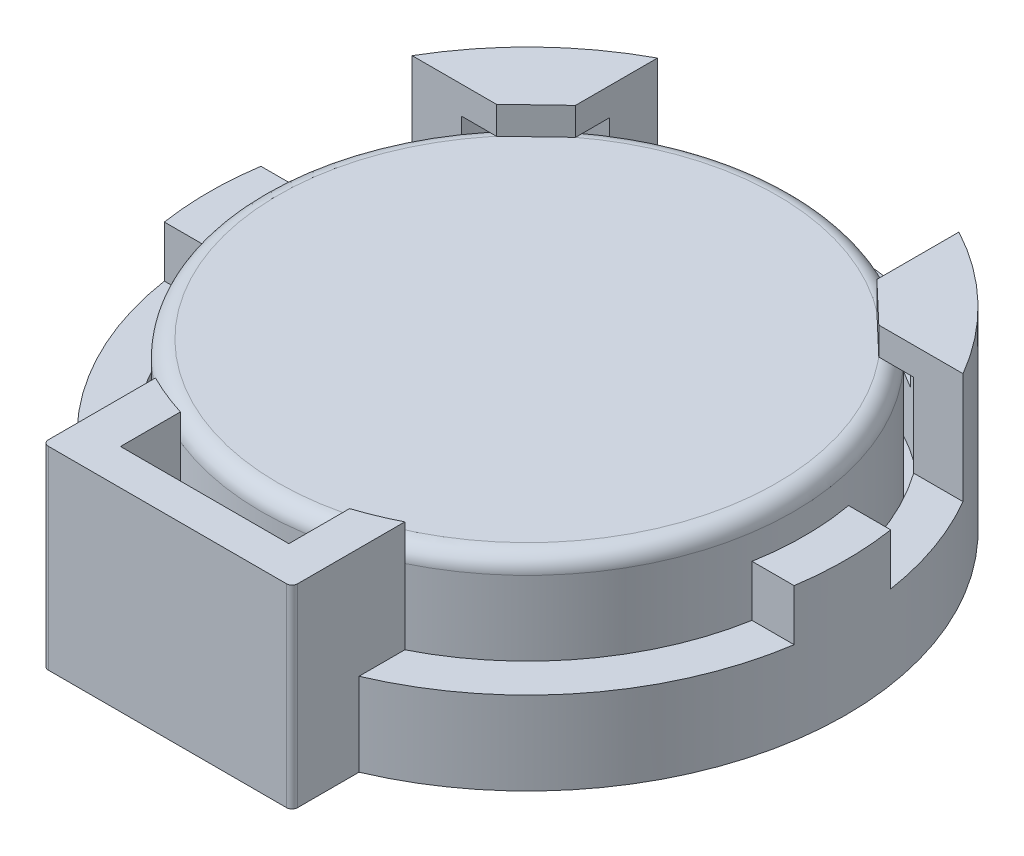
ISO-10303-21;
HEADER;
FILE_DESCRIPTION(('STEP AP214'),'2;1');
FILE_NAME('part.step','',(''),(''),'','','');
FILE_SCHEMA(('AUTOMOTIVE_DESIGN { 1 0 10303 214 1 1 1 1 }'));
ENDSEC;
DATA;
#1=APPLICATION_CONTEXT('core data for automotive mechanical design processes');
#2=APPLICATION_PROTOCOL_DEFINITION('international standard','automotive_design',2000,#1);
#3=PRODUCT_CONTEXT('',#1,'mechanical');
#4=PRODUCT('Part','Part','',(#3));
#5=PRODUCT_RELATED_PRODUCT_CATEGORY('part','',(#4));
#6=PRODUCT_DEFINITION_FORMATION('','',#4);
#7=PRODUCT_DEFINITION_CONTEXT('part definition',#1,'design');
#8=PRODUCT_DEFINITION('design','',#6,#7);
#9=PRODUCT_DEFINITION_SHAPE('','',#8);
#10=(LENGTH_UNIT() NAMED_UNIT(*) SI_UNIT(.MILLI.,.METRE.));
#11=(NAMED_UNIT(*) PLANE_ANGLE_UNIT() SI_UNIT($,.RADIAN.));
#12=(NAMED_UNIT(*) SI_UNIT($,.STERADIAN.) SOLID_ANGLE_UNIT());
#13=UNCERTAINTY_MEASURE_WITH_UNIT(LENGTH_MEASURE(1.E-05),#10,'distance_accuracy_value','');
#14=(GEOMETRIC_REPRESENTATION_CONTEXT(3) GLOBAL_UNCERTAINTY_ASSIGNED_CONTEXT((#13)) GLOBAL_UNIT_ASSIGNED_CONTEXT((#10,
#11,#12)) REPRESENTATION_CONTEXT('',''));
#15=CARTESIAN_POINT('',(0.,0.,0.));
#16=DIRECTION('',(0.,0.,1.));
#17=DIRECTION('',(1.,0.,0.));
#18=AXIS2_PLACEMENT_3D('',#15,#16,#17);
#19=CARTESIAN_POINT('',(0.,1.,0.));
#20=DIRECTION('',(0.,1.,0.));
#21=DIRECTION('',(0.,0.,1.));
#22=AXIS2_PLACEMENT_3D('',#19,#20,#21);
#23=CYLINDRICAL_SURFACE('',#22,10.);
#24=CARTESIAN_POINT('',(0.,1.,0.));
#25=DIRECTION('',(0.,1.,0.));
#26=DIRECTION('',(0.,0.,1.));
#27=AXIS2_PLACEMENT_3D('',#24,#25,#26);
#28=CIRCLE('',#27,10.);
#29=CARTESIAN_POINT('',(0.,1.,10.));
#30=VERTEX_POINT('',#29);
#31=EDGE_CURVE('E453',#30,#30,#28,.T.);
#32=ORIENTED_EDGE('',*,*,#31,.F.);
#33=EDGE_LOOP('',(#32));
#34=FACE_BOUND('',#33,.T.);
#35=CARTESIAN_POINT('',(0.,6.,0.));
#36=DIRECTION('',(0.,1.,0.));
#37=DIRECTION('',(0.,0.,1.));
#38=AXIS2_PLACEMENT_3D('',#35,#36,#37);
#39=CIRCLE('',#38,10.);
#40=CARTESIAN_POINT('',(8.16170008433562,6.,-5.77811835577604));
#41=VERTEX_POINT('',#40);
#42=CARTESIAN_POINT('',(5.44030687455703,6.,-8.39065319928357));
#43=VERTEX_POINT('',#42);
#44=EDGE_CURVE('E278',#41,#43,#39,.T.);
#45=ORIENTED_EDGE('',*,*,#44,.T.);
#46=DIRECTION('',(0.,1.,0.));
#47=VECTOR('',#46,1.);
#48=CARTESIAN_POINT('',(5.44030687455703,1.,-8.39065319928357));
#49=LINE('',#48,#47);
#50=CARTESIAN_POINT('',(5.44030687455703,3.,-8.39065319928357));
#51=VERTEX_POINT('',#50);
#52=EDGE_CURVE('E268',#43,#51,#49,.F.);
#53=ORIENTED_EDGE('',*,*,#52,.T.);
#54=CARTESIAN_POINT('',(0.,3.,0.));
#55=DIRECTION('',(0.,1.,0.));
#56=DIRECTION('',(0.,0.,1.));
#57=AXIS2_PLACEMENT_3D('',#54,#55,#56);
#58=CIRCLE('',#57,10.);
#59=CARTESIAN_POINT('',(-5.44030687455703,3.,-8.39065319928357));
#60=VERTEX_POINT('',#59);
#61=EDGE_CURVE('E276',#60,#51,#58,.F.);
#62=ORIENTED_EDGE('',*,*,#61,.F.);
#63=DIRECTION('',(0.,1.,0.));
#64=VECTOR('',#63,1.);
#65=CARTESIAN_POINT('',(-5.44030687455703,1.,-8.39065319928357));
#66=LINE('',#65,#64);
#67=CARTESIAN_POINT('',(-5.44030687455703,6.,-8.39065319928357));
#68=VERTEX_POINT('',#67);
#69=EDGE_CURVE('E67',#60,#68,#66,.T.);
#70=ORIENTED_EDGE('',*,*,#69,.T.);
#71=CARTESIAN_POINT('',(0.,6.,0.));
#72=DIRECTION('',(0.,1.,0.));
#73=DIRECTION('',(0.,0.,-1.));
#74=AXIS2_PLACEMENT_3D('',#71,#72,#73);
#75=CIRCLE('',#74,10.);
#76=CARTESIAN_POINT('',(-8.16170008433562,6.,-5.77811835577604));
#77=VERTEX_POINT('',#76);
#78=EDGE_CURVE('E301',#68,#77,#75,.T.);
#79=ORIENTED_EDGE('',*,*,#78,.T.);
#80=DIRECTION('',(0.,1.,0.));
#81=VECTOR('',#80,1.);
#82=CARTESIAN_POINT('',(-8.16170008433562,1.,-5.77811835577604));
#83=LINE('',#82,#81);
#84=CARTESIAN_POINT('',(-8.16170008433561,3.,-5.77811835577604));
#85=VERTEX_POINT('',#84);
#86=EDGE_CURVE('E472',#77,#85,#83,.F.);
#87=ORIENTED_EDGE('',*,*,#86,.T.);
#88=CARTESIAN_POINT('',(-9.84688215398306,3.,-1.74324749980313));
#89=VERTEX_POINT('',#88);
#90=EDGE_CURVE('E467',#89,#85,#58,.F.);
#91=ORIENTED_EDGE('',*,*,#90,.F.);
#92=DIRECTION('',(0.,1.,0.));
#93=VECTOR('',#92,1.);
#94=CARTESIAN_POINT('',(-9.84688215398306,1.,-1.74324749980313));
#95=LINE('',#94,#93);
#96=CARTESIAN_POINT('',(-9.84688215398307,4.84705488621152,-1.74324749980313));
#97=VERTEX_POINT('',#96);
#98=EDGE_CURVE('E474',#89,#97,#95,.T.);
#99=ORIENTED_EDGE('',*,*,#98,.T.);
#100=CARTESIAN_POINT('',(0.,4.84705488621152,0.));
#101=DIRECTION('',(0.,-1.,0.));
#102=DIRECTION('',(0.,0.,-1.));
#103=AXIS2_PLACEMENT_3D('',#100,#101,#102);
#104=CIRCLE('',#103,10.);
#105=CARTESIAN_POINT('',(-9.84688215398306,4.84705488621152,1.74324749980313));
#106=VERTEX_POINT('',#105);
#107=EDGE_CURVE('E385',#97,#106,#104,.F.);
#108=ORIENTED_EDGE('',*,*,#107,.T.);
#109=DIRECTION('',(0.,1.,0.));
#110=VECTOR('',#109,1.);
#111=CARTESIAN_POINT('',(-9.84688215398306,1.,1.74324749980313));
#112=LINE('',#111,#110);
#113=CARTESIAN_POINT('',(-9.84688215398306,3.,1.74324749980313));
#114=VERTEX_POINT('',#113);
#115=EDGE_CURVE('E485',#106,#114,#112,.F.);
#116=ORIENTED_EDGE('',*,*,#115,.T.);
#117=CARTESIAN_POINT('',(0.,3.,0.));
#118=DIRECTION('',(0.,1.,0.));
#119=DIRECTION('',(0.,0.,1.));
#120=AXIS2_PLACEMENT_3D('',#117,#118,#119);
#121=CIRCLE('',#120,10.);
#122=CARTESIAN_POINT('',(-4.5,3.,8.93028554974588));
#123=VERTEX_POINT('',#122);
#124=EDGE_CURVE('E477',#123,#114,#121,.F.);
#125=ORIENTED_EDGE('',*,*,#124,.F.);
#126=DIRECTION('',(0.,-1.,0.));
#127=VECTOR('',#126,1.);
#128=CARTESIAN_POINT('',(-4.5,7.,8.93028554974588));
#129=LINE('',#128,#127);
#130=CARTESIAN_POINT('',(-4.5,7.,8.93028554974588));
#131=VERTEX_POINT('',#130);
#132=EDGE_CURVE('E354',#131,#123,#129,.T.);
#133=ORIENTED_EDGE('',*,*,#132,.F.);
#134=CARTESIAN_POINT('',(0.,7.,0.));
#135=DIRECTION('',(0.,-1.,0.));
#136=DIRECTION('',(0.,0.,-1.));
#137=AXIS2_PLACEMENT_3D('',#134,#135,#136);
#138=CIRCLE('',#137,10.);
#139=CARTESIAN_POINT('',(-2.9884242853768,7.,9.54302469296659));
#140=VERTEX_POINT('',#139);
#141=EDGE_CURVE('E352',#140,#131,#138,.T.);
#142=ORIENTED_EDGE('',*,*,#141,.F.);
#143=DIRECTION('',(0.,-1.,0.));
#144=VECTOR('',#143,1.);
#145=CARTESIAN_POINT('',(-2.9884242853768,7.,9.54302469296659));
#146=LINE('',#145,#144);
#147=CARTESIAN_POINT('',(-2.9884242853768,3.,9.54302469296659));
#148=VERTEX_POINT('',#147);
#149=EDGE_CURVE('E357',#140,#148,#146,.T.);
#150=ORIENTED_EDGE('',*,*,#149,.T.);
#151=CARTESIAN_POINT('',(3.08803842822269,3.,9.51125747027279));
#152=VERTEX_POINT('',#151);
#153=EDGE_CURVE('E482',#152,#148,#121,.F.);
#154=ORIENTED_EDGE('',*,*,#153,.F.);
#155=DIRECTION('',(0.,-1.,0.));
#156=VECTOR('',#155,1.);
#157=CARTESIAN_POINT('',(3.08803842822269,7.,9.51125747027279));
#158=LINE('',#157,#156);
#159=CARTESIAN_POINT('',(3.08803842822269,7.,9.51125747027279));
#160=VERTEX_POINT('',#159);
#161=EDGE_CURVE('E365',#160,#152,#158,.T.);
#162=ORIENTED_EDGE('',*,*,#161,.F.);
#163=CARTESIAN_POINT('',(0.,7.,0.));
#164=DIRECTION('',(0.,-1.,0.));
#165=DIRECTION('',(0.,0.,-1.));
#166=AXIS2_PLACEMENT_3D('',#163,#164,#165);
#167=CIRCLE('',#166,10.);
#168=CARTESIAN_POINT('',(4.5,7.,8.93028554974588));
#169=VERTEX_POINT('',#168);
#170=EDGE_CURVE('E344',#169,#160,#167,.T.);
#171=ORIENTED_EDGE('',*,*,#170,.F.);
#172=DIRECTION('',(0.,-1.,0.));
#173=VECTOR('',#172,1.);
#174=CARTESIAN_POINT('',(4.5,7.,8.93028554974588));
#175=LINE('',#174,#173);
#176=CARTESIAN_POINT('',(4.5,3.,8.93028554974588));
#177=VERTEX_POINT('',#176);
#178=EDGE_CURVE('E367',#169,#177,#175,.T.);
#179=ORIENTED_EDGE('',*,*,#178,.T.);
#180=CARTESIAN_POINT('',(9.84688215398306,3.,1.74324749980313));
#181=VERTEX_POINT('',#180);
#182=EDGE_CURVE('E478',#181,#177,#121,.F.);
#183=ORIENTED_EDGE('',*,*,#182,.F.);
#184=DIRECTION('',(0.,1.,0.));
#185=VECTOR('',#184,1.);
#186=CARTESIAN_POINT('',(9.84688215398306,1.,1.74324749980313));
#187=LINE('',#186,#185);
#188=CARTESIAN_POINT('',(9.84688215398306,4.84705488621152,1.74324749980313));
#189=VERTEX_POINT('',#188);
#190=EDGE_CURVE('E481',#181,#189,#187,.T.);
#191=ORIENTED_EDGE('',*,*,#190,.T.);
#192=CARTESIAN_POINT('',(9.84688215398306,4.84705488621152,-1.74324749980313));
#193=VERTEX_POINT('',#192);
#194=EDGE_CURVE('E389',#189,#193,#104,.F.);
#195=ORIENTED_EDGE('',*,*,#194,.T.);
#196=DIRECTION('',(0.,1.,0.));
#197=VECTOR('',#196,1.);
#198=CARTESIAN_POINT('',(9.84688215398306,1.,-1.74324749980313));
#199=LINE('',#198,#197);
#200=CARTESIAN_POINT('',(9.84688215398306,3.,-1.74324749980313));
#201=VERTEX_POINT('',#200);
#202=EDGE_CURVE('E469',#193,#201,#199,.F.);
#203=ORIENTED_EDGE('',*,*,#202,.T.);
#204=CARTESIAN_POINT('',(8.16170008433562,3.,-5.77811835577604));
#205=VERTEX_POINT('',#204);
#206=EDGE_CURVE('E464',#205,#201,#58,.F.);
#207=ORIENTED_EDGE('',*,*,#206,.F.);
#208=DIRECTION('',(0.,1.,0.));
#209=VECTOR('',#208,1.);
#210=CARTESIAN_POINT('',(8.16170008433562,1.,-5.77811835577604));
#211=LINE('',#210,#209);
#212=EDGE_CURVE('E60',#205,#41,#211,.T.);
#213=ORIENTED_EDGE('',*,*,#212,.T.);
#214=EDGE_LOOP('',(#45,#53,#62,#70,#79,#87,#91,#99,#108,#116,#125,#133,#142,#150,#154,#162,#171,
#179,#183,#191,#195,#203,#207,#213));
#215=FACE_BOUND('',#214,.T.);
#216=ADVANCED_FACE('F45',(#34,#215),#23,.F.);
#217=CARTESIAN_POINT('',(0.,7.,0.));
#218=DIRECTION('',(0.,-1.,0.));
#219=DIRECTION('',(0.,0.,-1.));
#220=AXIS2_PLACEMENT_3D('',#217,#218,#219);
#221=CYLINDRICAL_SURFACE('',#220,11.5);
#222=DIRECTION('',(0.,-1.,0.));
#223=VECTOR('',#222,1.);
#224=CARTESIAN_POINT('',(-4.5,7.,10.5830052442584));
#225=LINE('',#224,#223);
#226=CARTESIAN_POINT('',(-4.5,3.,10.5830052442584));
#227=VERTEX_POINT('',#226);
#228=CARTESIAN_POINT('',(-4.5,0.,10.5830052442584));
#229=VERTEX_POINT('',#228);
#230=EDGE_CURVE('E377',#227,#229,#225,.T.);
#231=ORIENTED_EDGE('',*,*,#230,.F.);
#232=CARTESIAN_POINT('',(0.,3.,0.));
#233=DIRECTION('',(0.,1.,0.));
#234=DIRECTION('',(0.,0.,1.));
#235=AXIS2_PLACEMENT_3D('',#232,#233,#234);
#236=CIRCLE('',#235,11.5);
#237=CARTESIAN_POINT('',(-11.3671055310677,3.,1.74324749980313));
#238=VERTEX_POINT('',#237);
#239=EDGE_CURVE('E400',#238,#227,#236,.T.);
#240=ORIENTED_EDGE('',*,*,#239,.F.);
#241=DIRECTION('',(0.,-1.,0.));
#242=VECTOR('',#241,1.);
#243=CARTESIAN_POINT('',(-11.3671055310677,7.,1.74324749980313));
#244=LINE('',#243,#242);
#245=CARTESIAN_POINT('',(-11.3671055310677,4.84705488621152,1.74324749980313));
#246=VERTEX_POINT('',#245);
#247=EDGE_CURVE('E403',#238,#246,#244,.F.);
#248=ORIENTED_EDGE('',*,*,#247,.T.);
#249=CARTESIAN_POINT('',(0.,4.84705488621152,0.));
#250=DIRECTION('',(0.,-1.,0.));
#251=DIRECTION('',(0.,0.,-1.));
#252=AXIS2_PLACEMENT_3D('',#249,#250,#251);
#253=CIRCLE('',#252,11.5);
#254=CARTESIAN_POINT('',(-11.3671055310677,4.84705488621152,-1.74324749980313));
#255=VERTEX_POINT('',#254);
#256=EDGE_CURVE('E388',#246,#255,#253,.T.);
#257=ORIENTED_EDGE('',*,*,#256,.T.);
#258=DIRECTION('',(0.,-1.,0.));
#259=VECTOR('',#258,1.);
#260=CARTESIAN_POINT('',(-11.3671055310677,7.,-1.74324749980313));
#261=LINE('',#260,#259);
#262=CARTESIAN_POINT('',(-11.3671055310677,3.,-1.74324749980313));
#263=VERTEX_POINT('',#262);
#264=EDGE_CURVE('E451',#255,#263,#261,.T.);
#265=ORIENTED_EDGE('',*,*,#264,.T.);
#266=CARTESIAN_POINT('',(0.,3.,0.));
#267=DIRECTION('',(0.,1.,0.));
#268=DIRECTION('',(0.,0.,1.));
#269=AXIS2_PLACEMENT_3D('',#266,#267,#268);
#270=CIRCLE('',#269,11.5);
#271=CARTESIAN_POINT('',(-9.94300499178412,3.,-5.77811835577604));
#272=VERTEX_POINT('',#271);
#273=EDGE_CURVE('E431',#272,#263,#270,.T.);
#274=ORIENTED_EDGE('',*,*,#273,.F.);
#275=DIRECTION('',(0.,-1.,0.));
#276=VECTOR('',#275,1.);
#277=CARTESIAN_POINT('',(-9.94300499178412,7.,-5.77811835577604));
#278=LINE('',#277,#276);
#279=CARTESIAN_POINT('',(-9.94300499178412,7.,-5.77811835577604));
#280=VERTEX_POINT('',#279);
#281=EDGE_CURVE('E445',#272,#280,#278,.F.);
#282=ORIENTED_EDGE('',*,*,#281,.T.);
#283=CARTESIAN_POINT('',(0.,7.,0.));
#284=DIRECTION('',(0.,1.,0.));
#285=DIRECTION('',(0.,0.,1.));
#286=AXIS2_PLACEMENT_3D('',#283,#284,#285);
#287=CIRCLE('',#286,11.5);
#288=CARTESIAN_POINT('',(-5.44030687455703,7.,-10.1317846952374));
#289=VERTEX_POINT('',#288);
#290=EDGE_CURVE('E457',#289,#280,#287,.T.);
#291=ORIENTED_EDGE('',*,*,#290,.F.);
#292=DIRECTION('',(0.,-1.,0.));
#293=VECTOR('',#292,1.);
#294=CARTESIAN_POINT('',(-5.44030687455703,7.,-10.1317846952374));
#295=LINE('',#294,#293);
#296=CARTESIAN_POINT('',(-5.44030687455703,3.,-10.1317846952374));
#297=VERTEX_POINT('',#296);
#298=EDGE_CURVE('E442',#289,#297,#295,.T.);
#299=ORIENTED_EDGE('',*,*,#298,.T.);
#300=CARTESIAN_POINT('',(5.44030687455703,3.,-10.1317846952374));
#301=VERTEX_POINT('',#300);
#302=EDGE_CURVE('E434',#301,#297,#270,.T.);
#303=ORIENTED_EDGE('',*,*,#302,.F.);
#304=DIRECTION('',(0.,-1.,0.));
#305=VECTOR('',#304,1.);
#306=CARTESIAN_POINT('',(5.44030687455703,7.,-10.1317846952374));
#307=LINE('',#306,#305);
#308=CARTESIAN_POINT('',(5.44030687455703,7.,-10.1317846952374));
#309=VERTEX_POINT('',#308);
#310=EDGE_CURVE('E439',#301,#309,#307,.F.);
#311=ORIENTED_EDGE('',*,*,#310,.T.);
#312=CARTESIAN_POINT('',(9.94300499178412,7.,-5.77811835577604));
#313=VERTEX_POINT('',#312);
#314=EDGE_CURVE('E460',#313,#309,#287,.T.);
#315=ORIENTED_EDGE('',*,*,#314,.F.);
#316=DIRECTION('',(0.,-1.,0.));
#317=VECTOR('',#316,1.);
#318=CARTESIAN_POINT('',(9.94300499178412,7.,-5.77811835577604));
#319=LINE('',#318,#317);
#320=CARTESIAN_POINT('',(9.94300499178412,3.,-5.77811835577604));
#321=VERTEX_POINT('',#320);
#322=EDGE_CURVE('E436',#313,#321,#319,.T.);
#323=ORIENTED_EDGE('',*,*,#322,.T.);
#324=CARTESIAN_POINT('',(11.3671055310677,3.,-1.74324749980313));
#325=VERTEX_POINT('',#324);
#326=EDGE_CURVE('E435',#325,#321,#270,.T.);
#327=ORIENTED_EDGE('',*,*,#326,.F.);
#328=DIRECTION('',(0.,-1.,0.));
#329=VECTOR('',#328,1.);
#330=CARTESIAN_POINT('',(11.3671055310677,7.,-1.74324749980313));
#331=LINE('',#330,#329);
#332=CARTESIAN_POINT('',(11.3671055310677,4.84705488621152,-1.74324749980313));
#333=VERTEX_POINT('',#332);
#334=EDGE_CURVE('E448',#325,#333,#331,.F.);
#335=ORIENTED_EDGE('',*,*,#334,.T.);
#336=CARTESIAN_POINT('',(11.3671055310677,4.84705488621152,1.74324749980313));
#337=VERTEX_POINT('',#336);
#338=EDGE_CURVE('E393',#333,#337,#253,.T.);
#339=ORIENTED_EDGE('',*,*,#338,.T.);
#340=DIRECTION('',(0.,-1.,0.));
#341=VECTOR('',#340,1.);
#342=CARTESIAN_POINT('',(11.3671055310677,7.,1.74324749980313));
#343=LINE('',#342,#341);
#344=CARTESIAN_POINT('',(11.3671055310677,3.,1.74324749980313));
#345=VERTEX_POINT('',#344);
#346=EDGE_CURVE('E408',#337,#345,#343,.T.);
#347=ORIENTED_EDGE('',*,*,#346,.T.);
#348=CARTESIAN_POINT('',(4.5,3.,10.5830052442584));
#349=VERTEX_POINT('',#348);
#350=EDGE_CURVE('E405',#349,#345,#236,.T.);
#351=ORIENTED_EDGE('',*,*,#350,.F.);
#352=DIRECTION('',(0.,-1.,0.));
#353=VECTOR('',#352,1.);
#354=CARTESIAN_POINT('',(4.5,7.,10.5830052442584));
#355=LINE('',#354,#353);
#356=CARTESIAN_POINT('',(4.5,0.,10.5830052442584));
#357=VERTEX_POINT('',#356);
#358=EDGE_CURVE('E375',#357,#349,#355,.F.);
#359=ORIENTED_EDGE('',*,*,#358,.F.);
#360=CARTESIAN_POINT('',(0.,0.,0.));
#361=DIRECTION('',(0.,1.,0.));
#362=DIRECTION('',(0.,0.,1.));
#363=AXIS2_PLACEMENT_3D('',#360,#361,#362);
#364=CIRCLE('',#363,11.5);
#365=EDGE_CURVE('E461',#357,#229,#364,.T.);
#366=ORIENTED_EDGE('',*,*,#365,.T.);
#367=EDGE_LOOP('',(#231,#240,#248,#257,#265,#274,#282,#291,#299,#303,#311,#315,#323,#327,#335,
#339,#347,#351,#359,#366));
#368=FACE_BOUND('',#367,.T.);
#369=ADVANCED_FACE('F547',(#368),#221,.T.);
#370=DIRECTION('',(0.,-1.,0.));
#371=VECTOR('',#370,1.);
#372=CARTESIAN_POINT('',(3.08803842822269,7.,11.0776359691867));
#373=LINE('',#372,#371);
#374=CARTESIAN_POINT('',(3.08803842822269,3.,11.0776359691867));
#375=VERTEX_POINT('',#374);
#376=CARTESIAN_POINT('',(3.08803842822269,0.,11.0776359691867));
#377=VERTEX_POINT('',#376);
#378=EDGE_CURVE('E373',#375,#377,#373,.T.);
#379=ORIENTED_EDGE('',*,*,#378,.F.);
#380=CARTESIAN_POINT('',(-2.9884242853768,3.,11.1049232455956));
#381=VERTEX_POINT('',#380);
#382=EDGE_CURVE('E404',#381,#375,#236,.T.);
#383=ORIENTED_EDGE('',*,*,#382,.F.);
#384=DIRECTION('',(0.,-1.,0.));
#385=VECTOR('',#384,1.);
#386=CARTESIAN_POINT('',(-2.9884242853768,7.,11.1049232455956));
#387=LINE('',#386,#385);
#388=CARTESIAN_POINT('',(-2.9884242853768,0.,11.1049232455956));
#389=VERTEX_POINT('',#388);
#390=EDGE_CURVE('E370',#389,#381,#387,.F.);
#391=ORIENTED_EDGE('',*,*,#390,.F.);
#392=EDGE_CURVE('E456',#389,#377,#364,.T.);
#393=ORIENTED_EDGE('',*,*,#392,.T.);
#394=EDGE_LOOP('',(#379,#383,#391,#393));
#395=FACE_BOUND('',#394,.T.);
#396=ADVANCED_FACE('F615',(#395),#221,.T.);
#397=CARTESIAN_POINT('',(-12.6011890700055,3.,1.74324749980313));
#398=DIRECTION('',(0.,1.,0.));
#399=DIRECTION('',(0.,0.,1.));
#400=AXIS2_PLACEMENT_3D('',#397,#398,#399);
#401=PLANE('',#400);
#402=ORIENTED_EDGE('',*,*,#239,.T.);
#403=DIRECTION('',(0.,0.,-1.));
#404=VECTOR('',#403,1.);
#405=CARTESIAN_POINT('',(-4.5,3.,1.74324749980313));
#406=LINE('',#405,#404);
#407=EDGE_CURVE('E499',#227,#123,#406,.T.);
#408=ORIENTED_EDGE('',*,*,#407,.T.);
#409=ORIENTED_EDGE('',*,*,#124,.T.);
#410=DIRECTION('',(-1.,0.,0.));
#411=VECTOR('',#410,1.);
#412=CARTESIAN_POINT('',(12.0533112843531,3.,1.74324749980313));
#413=LINE('',#412,#411);
#414=EDGE_CURVE('E396',#114,#238,#413,.T.);
#415=ORIENTED_EDGE('',*,*,#414,.T.);
#416=EDGE_LOOP('',(#402,#408,#409,#415));
#417=FACE_BOUND('',#416,.T.);
#418=ADVANCED_FACE('F550',(#417),#401,.T.);
#419=ORIENTED_EDGE('',*,*,#182,.T.);
#420=DIRECTION('',(0.,0.,1.));
#421=VECTOR('',#420,1.);
#422=CARTESIAN_POINT('',(4.5,3.,1.74324749980313));
#423=LINE('',#422,#421);
#424=EDGE_CURVE('E496',#177,#349,#423,.T.);
#425=ORIENTED_EDGE('',*,*,#424,.T.);
#426=ORIENTED_EDGE('',*,*,#350,.T.);
#427=EDGE_CURVE('E399',#345,#181,#413,.T.);
#428=ORIENTED_EDGE('',*,*,#427,.T.);
#429=EDGE_LOOP('',(#419,#425,#426,#428));
#430=FACE_BOUND('',#429,.T.);
#431=ADVANCED_FACE('F660',(#430),#401,.T.);
#432=ORIENTED_EDGE('',*,*,#382,.T.);
#433=DIRECTION('',(0.,0.,-1.));
#434=VECTOR('',#433,1.);
#435=CARTESIAN_POINT('',(3.08803842822269,3.,1.74324749980313));
#436=LINE('',#435,#434);
#437=EDGE_CURVE('E493',#375,#152,#436,.T.);
#438=ORIENTED_EDGE('',*,*,#437,.T.);
#439=ORIENTED_EDGE('',*,*,#153,.T.);
#440=DIRECTION('',(0.,0.,1.));
#441=VECTOR('',#440,1.);
#442=CARTESIAN_POINT('',(-2.9884242853768,3.,1.74324749980313));
#443=LINE('',#442,#441);
#444=EDGE_CURVE('E491',#148,#381,#443,.T.);
#445=ORIENTED_EDGE('',*,*,#444,.T.);
#446=EDGE_LOOP('',(#432,#438,#439,#445));
#447=FACE_BOUND('',#446,.T.);
#448=ADVANCED_FACE('F661',(#447),#401,.T.);
#449=CARTESIAN_POINT('',(0.,7.,0.));
#450=DIRECTION('',(0.,1.,0.));
#451=DIRECTION('',(0.,0.,1.));
#452=AXIS2_PLACEMENT_3D('',#449,#450,#451);
#453=PLANE('',#452);
#454=DIRECTION('',(-1.,0.,0.));
#455=VECTOR('',#454,1.);
#456=CARTESIAN_POINT('',(-12.6011890700055,7.,-5.77811835577604));
#457=LINE('',#456,#455);
#458=CARTESIAN_POINT('',(-6.90165533026126,7.,-5.77811835577604));
#459=VERTEX_POINT('',#458);
#460=EDGE_CURVE('E414',#459,#280,#457,.T.);
#461=ORIENTED_EDGE('',*,*,#460,.F.);
#462=DIRECTION('',(0.723872275431072,0.,-0.689934003265706));
#463=VECTOR('',#462,1.);
#464=CARTESIAN_POINT('',(-6.90165533026126,7.,-5.77811835577604));
#465=LINE('',#464,#463);
#466=CARTESIAN_POINT('',(-5.44030687455703,7.,-7.17095245708178));
#467=VERTEX_POINT('',#466);
#468=EDGE_CURVE('E299',#459,#467,#465,.T.);
#469=ORIENTED_EDGE('',*,*,#468,.T.);
#470=DIRECTION('',(0.,0.,1.));
#471=VECTOR('',#470,1.);
#472=CARTESIAN_POINT('',(-5.44030687455703,7.,-5.77811835577604));
#473=LINE('',#472,#471);
#474=EDGE_CURVE('E428',#289,#467,#473,.T.);
#475=ORIENTED_EDGE('',*,*,#474,.F.);
#476=ORIENTED_EDGE('',*,*,#290,.T.);
#477=EDGE_LOOP('',(#461,#469,#475,#476));
#478=FACE_BOUND('',#477,.T.);
#479=ADVANCED_FACE('F571',(#478),#453,.T.);
#480=DIRECTION('',(0.,0.,-1.));
#481=VECTOR('',#480,1.);
#482=CARTESIAN_POINT('',(5.44030687455703,7.,-5.77811835577604));
#483=LINE('',#482,#481);
#484=CARTESIAN_POINT('',(5.44030687455703,7.,-7.17095245708178));
#485=VERTEX_POINT('',#484);
#486=EDGE_CURVE('E426',#485,#309,#483,.T.);
#487=ORIENTED_EDGE('',*,*,#486,.F.);
#488=DIRECTION('',(0.723872275431072,0.,0.689934003265706));
#489=VECTOR('',#488,1.);
#490=CARTESIAN_POINT('',(6.90165533026126,7.,-5.77811835577604));
#491=LINE('',#490,#489);
#492=CARTESIAN_POINT('',(6.90165533026126,7.,-5.77811835577604));
#493=VERTEX_POINT('',#492);
#494=EDGE_CURVE('E282',#485,#493,#491,.T.);
#495=ORIENTED_EDGE('',*,*,#494,.T.);
#496=DIRECTION('',(-1.,0.,0.));
#497=VECTOR('',#496,1.);
#498=CARTESIAN_POINT('',(12.0533112843531,7.,-5.77811835577604));
#499=LINE('',#498,#497);
#500=EDGE_CURVE('E411',#313,#493,#499,.T.);
#501=ORIENTED_EDGE('',*,*,#500,.F.);
#502=ORIENTED_EDGE('',*,*,#314,.T.);
#503=EDGE_LOOP('',(#487,#495,#501,#502));
#504=FACE_BOUND('',#503,.T.);
#505=ADVANCED_FACE('F597',(#504),#453,.T.);
#506=CARTESIAN_POINT('',(0.,0.,0.));
#507=DIRECTION('',(0.,1.,0.));
#508=DIRECTION('',(0.,0.,1.));
#509=AXIS2_PLACEMENT_3D('',#506,#507,#508);
#510=PLANE('',#509);
#511=DIRECTION('',(0.,0.,-1.));
#512=VECTOR('',#511,1.);
#513=CARTESIAN_POINT('',(4.5,0.,8.93028554974588));
#514=LINE('',#513,#512);
#515=CARTESIAN_POINT('',(4.5,0.,12.8));
#516=VERTEX_POINT('',#515);
#517=EDGE_CURVE('E326',#516,#357,#514,.T.);
#518=ORIENTED_EDGE('',*,*,#517,.F.);
#519=CARTESIAN_POINT('',(4.3,0.,12.8));
#520=DIRECTION('',(0.,1.,0.));
#521=DIRECTION('',(0.,0.,1.));
#522=AXIS2_PLACEMENT_3D('',#519,#520,#521);
#523=CIRCLE('',#522,0.2);
#524=CARTESIAN_POINT('',(4.3,0.,13.));
#525=VERTEX_POINT('',#524);
#526=EDGE_CURVE('E507',#516,#525,#523,.F.);
#527=ORIENTED_EDGE('',*,*,#526,.T.);
#528=DIRECTION('',(1.,0.,0.));
#529=VECTOR('',#528,1.);
#530=CARTESIAN_POINT('',(4.5,0.,13.));
#531=LINE('',#530,#529);
#532=CARTESIAN_POINT('',(-4.3,0.,13.));
#533=VERTEX_POINT('',#532);
#534=EDGE_CURVE('E323',#533,#525,#531,.T.);
#535=ORIENTED_EDGE('',*,*,#534,.F.);
#536=CARTESIAN_POINT('',(-4.3,0.,12.8));
#537=DIRECTION('',(0.,1.,0.));
#538=DIRECTION('',(0.,0.,1.));
#539=AXIS2_PLACEMENT_3D('',#536,#537,#538);
#540=CIRCLE('',#539,0.2);
#541=CARTESIAN_POINT('',(-4.5,0.,12.8));
#542=VERTEX_POINT('',#541);
#543=EDGE_CURVE('E505',#533,#542,#540,.F.);
#544=ORIENTED_EDGE('',*,*,#543,.T.);
#545=DIRECTION('',(0.,0.,1.));
#546=VECTOR('',#545,1.);
#547=CARTESIAN_POINT('',(-4.5,0.,8.93028554974588));
#548=LINE('',#547,#546);
#549=EDGE_CURVE('E318',#229,#542,#548,.T.);
#550=ORIENTED_EDGE('',*,*,#549,.F.);
#551=ORIENTED_EDGE('',*,*,#365,.F.);
#552=EDGE_LOOP('',(#518,#527,#535,#544,#550,#551));
#553=FACE_BOUND('',#552,.T.);
#554=DIRECTION('',(0.,0.,1.));
#555=VECTOR('',#554,1.);
#556=CARTESIAN_POINT('',(3.08803842822269,0.,9.51125747027279));
#557=LINE('',#556,#555);
#558=CARTESIAN_POINT('',(3.08803842822269,0.,11.7046617843925));
#559=VERTEX_POINT('',#558);
#560=EDGE_CURVE('E328',#377,#559,#557,.T.);
#561=ORIENTED_EDGE('',*,*,#560,.F.);
#562=ORIENTED_EDGE('',*,*,#392,.F.);
#563=DIRECTION('',(0.,0.,-1.));
#564=VECTOR('',#563,1.);
#565=CARTESIAN_POINT('',(-2.9884242853768,0.,9.54302469296659));
#566=LINE('',#565,#564);
#567=CARTESIAN_POINT('',(-2.9884242853768,0.,11.7046617843925));
#568=VERTEX_POINT('',#567);
#569=EDGE_CURVE('E333',#568,#389,#566,.T.);
#570=ORIENTED_EDGE('',*,*,#569,.F.);
#571=DIRECTION('',(-1.,0.,0.));
#572=VECTOR('',#571,1.);
#573=CARTESIAN_POINT('',(3.08803842822269,0.,11.7046617843925));
#574=LINE('',#573,#572);
#575=EDGE_CURVE('E330',#559,#568,#574,.T.);
#576=ORIENTED_EDGE('',*,*,#575,.F.);
#577=EDGE_LOOP('',(#561,#562,#570,#576));
#578=FACE_BOUND('',#577,.T.);
#579=ADVANCED_FACE('F531',(#553,#578),#510,.F.);
#580=CARTESIAN_POINT('',(0.,1.,0.));
#581=DIRECTION('',(0.,1.,0.));
#582=DIRECTION('',(0.,0.,1.));
#583=AXIS2_PLACEMENT_3D('',#580,#581,#582);
#584=PLANE('',#583);
#585=ORIENTED_EDGE('',*,*,#31,.T.);
#586=EDGE_LOOP('',(#585));
#587=FACE_BOUND('',#586,.T.);
#588=ADVANCED_FACE('F620',(#587),#584,.T.);
#589=CARTESIAN_POINT('',(12.0533112843531,3.,-12.6509961414285));
#590=DIRECTION('',(0.,1.,0.));
#591=DIRECTION('',(0.,0.,1.));
#592=AXIS2_PLACEMENT_3D('',#589,#590,#591);
#593=PLANE('',#592);
#594=ORIENTED_EDGE('',*,*,#326,.T.);
#595=DIRECTION('',(-1.,0.,0.));
#596=VECTOR('',#595,1.);
#597=CARTESIAN_POINT('',(12.0533112843531,3.,-5.77811835577604));
#598=LINE('',#597,#596);
#599=EDGE_CURVE('E412',#321,#205,#598,.T.);
#600=ORIENTED_EDGE('',*,*,#599,.T.);
#601=ORIENTED_EDGE('',*,*,#206,.T.);
#602=DIRECTION('',(1.,0.,0.));
#603=VECTOR('',#602,1.);
#604=CARTESIAN_POINT('',(12.0533112843531,3.,-1.74324749980313));
#605=LINE('',#604,#603);
#606=EDGE_CURVE('E421',#201,#325,#605,.T.);
#607=ORIENTED_EDGE('',*,*,#606,.T.);
#608=EDGE_LOOP('',(#594,#600,#601,#607));
#609=FACE_BOUND('',#608,.T.);
#610=ADVANCED_FACE('F589',(#609),#593,.T.);
#611=CARTESIAN_POINT('',(12.0533112843531,3.,-5.77811835577604));
#612=DIRECTION('',(0.,0.,-1.));
#613=DIRECTION('',(-1.,0.,0.));
#614=AXIS2_PLACEMENT_3D('',#611,#612,#613);
#615=PLANE('',#614);
#616=ORIENTED_EDGE('',*,*,#500,.T.);
#617=DIRECTION('',(0.,1.,0.));
#618=VECTOR('',#617,1.);
#619=CARTESIAN_POINT('',(6.90165533026126,6.,-5.77811835577604));
#620=LINE('',#619,#618);
#621=CARTESIAN_POINT('',(6.90165533026126,6.,-5.77811835577604));
#622=VERTEX_POINT('',#621);
#623=EDGE_CURVE('E296',#622,#493,#620,.T.);
#624=ORIENTED_EDGE('',*,*,#623,.F.);
#625=DIRECTION('',(1.,0.,0.));
#626=VECTOR('',#625,1.);
#627=CARTESIAN_POINT('',(8.16170008433562,6.,-5.77811835577604));
#628=LINE('',#627,#626);
#629=EDGE_CURVE('E289',#622,#41,#628,.T.);
#630=ORIENTED_EDGE('',*,*,#629,.T.);
#631=ORIENTED_EDGE('',*,*,#212,.F.);
#632=ORIENTED_EDGE('',*,*,#599,.F.);
#633=ORIENTED_EDGE('',*,*,#322,.F.);
#634=EDGE_LOOP('',(#616,#624,#630,#631,#632,#633));
#635=FACE_BOUND('',#634,.T.);
#636=ADVANCED_FACE('F592',(#635),#615,.F.);
#637=CARTESIAN_POINT('',(12.0533112843531,3.,-1.74324749980313));
#638=DIRECTION('',(0.,0.,1.));
#639=DIRECTION('',(1.,0.,0.));
#640=AXIS2_PLACEMENT_3D('',#637,#638,#639);
#641=PLANE('',#640);
#642=ORIENTED_EDGE('',*,*,#202,.F.);
#643=DIRECTION('',(1.,0.,0.));
#644=VECTOR('',#643,1.);
#645=CARTESIAN_POINT('',(12.0533112843531,4.84705488621152,-1.74324749980313));
#646=LINE('',#645,#644);
#647=EDGE_CURVE('E392',#193,#333,#646,.T.);
#648=ORIENTED_EDGE('',*,*,#647,.T.);
#649=ORIENTED_EDGE('',*,*,#334,.F.);
#650=ORIENTED_EDGE('',*,*,#606,.F.);
#651=EDGE_LOOP('',(#642,#648,#649,#650));
#652=FACE_BOUND('',#651,.T.);
#653=ADVANCED_FACE('F671',(#652),#641,.F.);
#654=ORIENTED_EDGE('',*,*,#302,.T.);
#655=DIRECTION('',(0.,0.,1.));
#656=VECTOR('',#655,1.);
#657=CARTESIAN_POINT('',(-5.44030687455703,3.,-5.77811835577604));
#658=LINE('',#657,#656);
#659=EDGE_CURVE('E416',#297,#60,#658,.T.);
#660=ORIENTED_EDGE('',*,*,#659,.T.);
#661=ORIENTED_EDGE('',*,*,#61,.T.);
#662=DIRECTION('',(0.,0.,-1.));
#663=VECTOR('',#662,1.);
#664=CARTESIAN_POINT('',(5.44030687455703,3.,-5.77811835577604));
#665=LINE('',#664,#663);
#666=EDGE_CURVE('E274',#51,#301,#665,.T.);
#667=ORIENTED_EDGE('',*,*,#666,.T.);
#668=EDGE_LOOP('',(#654,#660,#661,#667));
#669=FACE_BOUND('',#668,.T.);
#670=ADVANCED_FACE('F584',(#669),#593,.T.);
#671=CARTESIAN_POINT('',(5.44030687455703,3.,-5.77811835577604));
#672=DIRECTION('',(1.,0.,0.));
#673=DIRECTION('',(0.,0.,-1.));
#674=AXIS2_PLACEMENT_3D('',#671,#672,#673);
#675=PLANE('',#674);
#676=ORIENTED_EDGE('',*,*,#666,.F.);
#677=ORIENTED_EDGE('',*,*,#52,.F.);
#678=DIRECTION('',(0.,0.,1.));
#679=VECTOR('',#678,1.);
#680=CARTESIAN_POINT('',(5.44030687455703,6.,-8.39065319928357));
#681=LINE('',#680,#679);
#682=CARTESIAN_POINT('',(5.44030687455703,6.,-7.17095245708178));
#683=VERTEX_POINT('',#682);
#684=EDGE_CURVE('E272',#43,#683,#681,.T.);
#685=ORIENTED_EDGE('',*,*,#684,.T.);
#686=DIRECTION('',(0.,1.,0.));
#687=VECTOR('',#686,1.);
#688=CARTESIAN_POINT('',(5.44030687455703,6.,-7.17095245708178));
#689=LINE('',#688,#687);
#690=EDGE_CURVE('E293',#683,#485,#689,.T.);
#691=ORIENTED_EDGE('',*,*,#690,.T.);
#692=ORIENTED_EDGE('',*,*,#486,.T.);
#693=ORIENTED_EDGE('',*,*,#310,.F.);
#694=EDGE_LOOP('',(#676,#677,#685,#691,#692,#693));
#695=FACE_BOUND('',#694,.T.);
#696=ADVANCED_FACE('F269',(#695),#675,.F.);
#697=CARTESIAN_POINT('',(-5.44030687455703,3.,-5.77811835577604));
#698=DIRECTION('',(-1.,0.,0.));
#699=DIRECTION('',(0.,0.,1.));
#700=AXIS2_PLACEMENT_3D('',#697,#698,#699);
#701=PLANE('',#700);
#702=ORIENTED_EDGE('',*,*,#474,.T.);
#703=DIRECTION('',(0.,1.,0.));
#704=VECTOR('',#703,1.);
#705=CARTESIAN_POINT('',(-5.44030687455703,6.,-7.17095245708178));
#706=LINE('',#705,#704);
#707=CARTESIAN_POINT('',(-5.44030687455703,6.,-7.17095245708178));
#708=VERTEX_POINT('',#707);
#709=EDGE_CURVE('E315',#708,#467,#706,.T.);
#710=ORIENTED_EDGE('',*,*,#709,.F.);
#711=DIRECTION('',(0.,0.,-1.));
#712=VECTOR('',#711,1.);
#713=CARTESIAN_POINT('',(-5.44030687455703,6.,-8.39065319928357));
#714=LINE('',#713,#712);
#715=EDGE_CURVE('E309',#708,#68,#714,.T.);
#716=ORIENTED_EDGE('',*,*,#715,.T.);
#717=ORIENTED_EDGE('',*,*,#69,.F.);
#718=ORIENTED_EDGE('',*,*,#659,.F.);
#719=ORIENTED_EDGE('',*,*,#298,.F.);
#720=EDGE_LOOP('',(#702,#710,#716,#717,#718,#719));
#721=FACE_BOUND('',#720,.T.);
#722=ADVANCED_FACE('F574',(#721),#701,.F.);
#723=ORIENTED_EDGE('',*,*,#264,.F.);
#724=DIRECTION('',(1.,0.,0.));
#725=VECTOR('',#724,1.);
#726=CARTESIAN_POINT('',(12.0533112843531,4.84705488621152,-1.74324749980313));
#727=LINE('',#726,#725);
#728=EDGE_CURVE('E382',#255,#97,#727,.T.);
#729=ORIENTED_EDGE('',*,*,#728,.T.);
#730=ORIENTED_EDGE('',*,*,#98,.F.);
#731=EDGE_CURVE('E424',#263,#89,#605,.T.);
#732=ORIENTED_EDGE('',*,*,#731,.F.);
#733=EDGE_LOOP('',(#723,#729,#730,#732));
#734=FACE_BOUND('',#733,.T.);
#735=ADVANCED_FACE('F560',(#734),#641,.F.);
#736=CARTESIAN_POINT('',(-12.6011890700055,3.,-5.77811835577604));
#737=DIRECTION('',(0.,0.,-1.));
#738=DIRECTION('',(-1.,0.,0.));
#739=AXIS2_PLACEMENT_3D('',#736,#737,#738);
#740=PLANE('',#739);
#741=DIRECTION('',(-1.,0.,0.));
#742=VECTOR('',#741,1.);
#743=CARTESIAN_POINT('',(-12.6011890700055,3.,-5.77811835577604));
#744=LINE('',#743,#742);
#745=EDGE_CURVE('E418',#85,#272,#744,.T.);
#746=ORIENTED_EDGE('',*,*,#745,.F.);
#747=ORIENTED_EDGE('',*,*,#86,.F.);
#748=DIRECTION('',(1.,0.,0.));
#749=VECTOR('',#748,1.);
#750=CARTESIAN_POINT('',(-8.16170008433562,6.,-5.77811835577604));
#751=LINE('',#750,#749);
#752=CARTESIAN_POINT('',(-6.90165533026126,6.,-5.77811835577604));
#753=VERTEX_POINT('',#752);
#754=EDGE_CURVE('E303',#77,#753,#751,.T.);
#755=ORIENTED_EDGE('',*,*,#754,.T.);
#756=DIRECTION('',(0.,1.,0.));
#757=VECTOR('',#756,1.);
#758=CARTESIAN_POINT('',(-6.90165533026126,6.,-5.77811835577604));
#759=LINE('',#758,#757);
#760=EDGE_CURVE('E312',#753,#459,#759,.T.);
#761=ORIENTED_EDGE('',*,*,#760,.T.);
#762=ORIENTED_EDGE('',*,*,#460,.T.);
#763=ORIENTED_EDGE('',*,*,#281,.F.);
#764=EDGE_LOOP('',(#746,#747,#755,#761,#762,#763));
#765=FACE_BOUND('',#764,.T.);
#766=ADVANCED_FACE('F670',(#765),#740,.F.);
#767=ORIENTED_EDGE('',*,*,#273,.T.);
#768=ORIENTED_EDGE('',*,*,#731,.T.);
#769=ORIENTED_EDGE('',*,*,#90,.T.);
#770=ORIENTED_EDGE('',*,*,#745,.T.);
#771=EDGE_LOOP('',(#767,#768,#769,#770));
#772=FACE_BOUND('',#771,.T.);
#773=ADVANCED_FACE('F565',(#772),#593,.T.);
#774=CARTESIAN_POINT('',(12.0533112843531,3.,1.74324749980313));
#775=DIRECTION('',(0.,0.,-1.));
#776=DIRECTION('',(-1.,0.,0.));
#777=AXIS2_PLACEMENT_3D('',#774,#775,#776);
#778=PLANE('',#777);
#779=ORIENTED_EDGE('',*,*,#346,.F.);
#780=DIRECTION('',(1.,0.,0.));
#781=VECTOR('',#780,1.);
#782=CARTESIAN_POINT('',(12.0465194109772,4.84705488621152,1.74324749980313));
#783=LINE('',#782,#781);
#784=EDGE_CURVE('E380',#189,#337,#783,.T.);
#785=ORIENTED_EDGE('',*,*,#784,.F.);
#786=ORIENTED_EDGE('',*,*,#190,.F.);
#787=ORIENTED_EDGE('',*,*,#427,.F.);
#788=EDGE_LOOP('',(#779,#785,#786,#787));
#789=FACE_BOUND('',#788,.T.);
#790=ADVANCED_FACE('F662',(#789),#778,.F.);
#791=ORIENTED_EDGE('',*,*,#115,.F.);
#792=DIRECTION('',(-1.,0.,0.));
#793=VECTOR('',#792,1.);
#794=CARTESIAN_POINT('',(12.0533112843531,4.84705488621152,1.74324749980313));
#795=LINE('',#794,#793);
#796=EDGE_CURVE('E488',#106,#246,#795,.T.);
#797=ORIENTED_EDGE('',*,*,#796,.T.);
#798=ORIENTED_EDGE('',*,*,#247,.F.);
#799=ORIENTED_EDGE('',*,*,#414,.F.);
#800=EDGE_LOOP('',(#791,#797,#798,#799));
#801=FACE_BOUND('',#800,.T.);
#802=ADVANCED_FACE('F554',(#801),#778,.F.);
#803=CARTESIAN_POINT('',(12.0465194109772,4.84705488621152,-2.25675250019687));
#804=DIRECTION('',(0.,-1.,0.));
#805=DIRECTION('',(0.,0.,-1.));
#806=AXIS2_PLACEMENT_3D('',#803,#804,#805);
#807=PLANE('',#806);
#808=ORIENTED_EDGE('',*,*,#796,.F.);
#809=ORIENTED_EDGE('',*,*,#107,.F.);
#810=ORIENTED_EDGE('',*,*,#728,.F.);
#811=ORIENTED_EDGE('',*,*,#256,.F.);
#812=EDGE_LOOP('',(#808,#809,#810,#811));
#813=FACE_BOUND('',#812,.T.);
#814=ADVANCED_FACE('F656',(#813),#807,.F.);
#815=ORIENTED_EDGE('',*,*,#647,.F.);
#816=ORIENTED_EDGE('',*,*,#194,.F.);
#817=ORIENTED_EDGE('',*,*,#784,.T.);
#818=ORIENTED_EDGE('',*,*,#338,.F.);
#819=EDGE_LOOP('',(#815,#816,#817,#818));
#820=FACE_BOUND('',#819,.T.);
#821=ADVANCED_FACE('F653',(#820),#807,.F.);
#822=CARTESIAN_POINT('',(-4.5,7.,8.93028554974588));
#823=DIRECTION('',(1.,0.,0.));
#824=DIRECTION('',(0.,0.,-1.));
#825=AXIS2_PLACEMENT_3D('',#822,#823,#824);
#826=PLANE('',#825);
#827=ORIENTED_EDGE('',*,*,#549,.T.);
#828=DIRECTION('',(0.,-1.,0.));
#829=VECTOR('',#828,1.);
#830=CARTESIAN_POINT('',(-4.5,7.,12.8));
#831=LINE('',#830,#829);
#832=CARTESIAN_POINT('',(-4.5,7.,12.8));
#833=VERTEX_POINT('',#832);
#834=EDGE_CURVE('E12',#542,#833,#831,.F.);
#835=ORIENTED_EDGE('',*,*,#834,.T.);
#836=DIRECTION('',(0.,0.,1.));
#837=VECTOR('',#836,1.);
#838=CARTESIAN_POINT('',(-4.5,7.,8.93028554974588));
#839=LINE('',#838,#837);
#840=EDGE_CURVE('E336',#131,#833,#839,.T.);
#841=ORIENTED_EDGE('',*,*,#840,.F.);
#842=ORIENTED_EDGE('',*,*,#132,.T.);
#843=ORIENTED_EDGE('',*,*,#407,.F.);
#844=ORIENTED_EDGE('',*,*,#230,.T.);
#845=EDGE_LOOP('',(#827,#835,#841,#842,#843,#844));
#846=FACE_BOUND('',#845,.T.);
#847=ADVANCED_FACE('F542',(#846),#826,.F.);
#848=CARTESIAN_POINT('',(4.5,7.,8.93028554974588));
#849=DIRECTION('',(-1.,0.,0.));
#850=DIRECTION('',(0.,0.,1.));
#851=AXIS2_PLACEMENT_3D('',#848,#849,#850);
#852=PLANE('',#851);
#853=DIRECTION('',(0.,0.,-1.));
#854=VECTOR('',#853,1.);
#855=CARTESIAN_POINT('',(4.5,7.,8.93028554974588));
#856=LINE('',#855,#854);
#857=CARTESIAN_POINT('',(4.5,7.,12.8));
#858=VERTEX_POINT('',#857);
#859=EDGE_CURVE('E342',#858,#169,#856,.T.);
#860=ORIENTED_EDGE('',*,*,#859,.F.);
#861=DIRECTION('',(0.,-1.,0.));
#862=VECTOR('',#861,1.);
#863=CARTESIAN_POINT('',(4.5,7.,12.8));
#864=LINE('',#863,#862);
#865=EDGE_CURVE('E502',#858,#516,#864,.T.);
#866=ORIENTED_EDGE('',*,*,#865,.T.);
#867=ORIENTED_EDGE('',*,*,#517,.T.);
#868=ORIENTED_EDGE('',*,*,#358,.T.);
#869=ORIENTED_EDGE('',*,*,#424,.F.);
#870=ORIENTED_EDGE('',*,*,#178,.F.);
#871=EDGE_LOOP('',(#860,#866,#867,#868,#869,#870));
#872=FACE_BOUND('',#871,.T.);
#873=ADVANCED_FACE('F525',(#872),#852,.F.);
#874=CARTESIAN_POINT('',(3.08803842822269,7.,9.51125747027279));
#875=DIRECTION('',(1.,0.,0.));
#876=DIRECTION('',(0.,0.,-1.));
#877=AXIS2_PLACEMENT_3D('',#874,#875,#876);
#878=PLANE('',#877);
#879=ORIENTED_EDGE('',*,*,#437,.F.);
#880=ORIENTED_EDGE('',*,*,#378,.T.);
#881=ORIENTED_EDGE('',*,*,#560,.T.);
#882=DIRECTION('',(0.,-1.,0.));
#883=VECTOR('',#882,1.);
#884=CARTESIAN_POINT('',(3.08803842822269,7.,11.7046617843925));
#885=LINE('',#884,#883);
#886=CARTESIAN_POINT('',(3.08803842822269,7.,11.7046617843925));
#887=VERTEX_POINT('',#886);
#888=EDGE_CURVE('E362',#887,#559,#885,.T.);
#889=ORIENTED_EDGE('',*,*,#888,.F.);
#890=DIRECTION('',(0.,0.,1.));
#891=VECTOR('',#890,1.);
#892=CARTESIAN_POINT('',(3.08803842822269,7.,9.51125747027279));
#893=LINE('',#892,#891);
#894=EDGE_CURVE('E346',#160,#887,#893,.T.);
#895=ORIENTED_EDGE('',*,*,#894,.F.);
#896=ORIENTED_EDGE('',*,*,#161,.T.);
#897=EDGE_LOOP('',(#879,#880,#881,#889,#895,#896));
#898=FACE_BOUND('',#897,.T.);
#899=ADVANCED_FACE('F641',(#898),#878,.F.);
#900=CARTESIAN_POINT('',(-2.9884242853768,7.,9.54302469296659));
#901=DIRECTION('',(-1.,0.,0.));
#902=DIRECTION('',(0.,0.,1.));
#903=AXIS2_PLACEMENT_3D('',#900,#901,#902);
#904=PLANE('',#903);
#905=ORIENTED_EDGE('',*,*,#569,.T.);
#906=ORIENTED_EDGE('',*,*,#390,.T.);
#907=ORIENTED_EDGE('',*,*,#444,.F.);
#908=ORIENTED_EDGE('',*,*,#149,.F.);
#909=DIRECTION('',(0.,0.,-1.));
#910=VECTOR('',#909,1.);
#911=CARTESIAN_POINT('',(-2.9884242853768,7.,9.54302469296659));
#912=LINE('',#911,#910);
#913=CARTESIAN_POINT('',(-2.9884242853768,7.,11.7046617843925));
#914=VERTEX_POINT('',#913);
#915=EDGE_CURVE('E350',#914,#140,#912,.T.);
#916=ORIENTED_EDGE('',*,*,#915,.F.);
#917=DIRECTION('',(0.,-1.,0.));
#918=VECTOR('',#917,1.);
#919=CARTESIAN_POINT('',(-2.9884242853768,7.,11.7046617843925));
#920=LINE('',#919,#918);
#921=EDGE_CURVE('E360',#914,#568,#920,.T.);
#922=ORIENTED_EDGE('',*,*,#921,.T.);
#923=EDGE_LOOP('',(#905,#906,#907,#908,#916,#922));
#924=FACE_BOUND('',#923,.T.);
#925=ADVANCED_FACE('F639',(#924),#904,.F.);
#926=CARTESIAN_POINT('',(4.5,7.,13.));
#927=DIRECTION('',(0.,0.,-1.));
#928=DIRECTION('',(-1.,0.,0.));
#929=AXIS2_PLACEMENT_3D('',#926,#927,#928);
#930=PLANE('',#929);
#931=ORIENTED_EDGE('',*,*,#534,.T.);
#932=DIRECTION('',(0.,-1.,0.));
#933=VECTOR('',#932,1.);
#934=CARTESIAN_POINT('',(4.3,7.,13.));
#935=LINE('',#934,#933);
#936=CARTESIAN_POINT('',(4.3,7.,13.));
#937=VERTEX_POINT('',#936);
#938=EDGE_CURVE('E512',#525,#937,#935,.F.);
#939=ORIENTED_EDGE('',*,*,#938,.T.);
#940=DIRECTION('',(1.,0.,0.));
#941=VECTOR('',#940,1.);
#942=CARTESIAN_POINT('',(4.5,7.,13.));
#943=LINE('',#942,#941);
#944=CARTESIAN_POINT('',(-4.3,7.,13.));
#945=VERTEX_POINT('',#944);
#946=EDGE_CURVE('E339',#945,#937,#943,.T.);
#947=ORIENTED_EDGE('',*,*,#946,.F.);
#948=DIRECTION('',(0.,-1.,0.));
#949=VECTOR('',#948,1.);
#950=CARTESIAN_POINT('',(-4.3,7.,13.));
#951=LINE('',#950,#949);
#952=EDGE_CURVE('E509',#945,#533,#951,.T.);
#953=ORIENTED_EDGE('',*,*,#952,.T.);
#954=EDGE_LOOP('',(#931,#939,#947,#953));
#955=FACE_BOUND('',#954,.T.);
#956=ADVANCED_FACE('F535',(#955),#930,.F.);
#957=CARTESIAN_POINT('',(3.08803842822269,7.,11.7046617843925));
#958=DIRECTION('',(0.,0.,1.));
#959=DIRECTION('',(1.,0.,0.));
#960=AXIS2_PLACEMENT_3D('',#957,#958,#959);
#961=PLANE('',#960);
#962=ORIENTED_EDGE('',*,*,#888,.T.);
#963=ORIENTED_EDGE('',*,*,#575,.T.);
#964=ORIENTED_EDGE('',*,*,#921,.F.);
#965=DIRECTION('',(-1.,0.,0.));
#966=VECTOR('',#965,1.);
#967=CARTESIAN_POINT('',(3.08803842822269,7.,11.7046617843925));
#968=LINE('',#967,#966);
#969=EDGE_CURVE('E348',#887,#914,#968,.T.);
#970=ORIENTED_EDGE('',*,*,#969,.F.);
#971=EDGE_LOOP('',(#962,#963,#964,#970));
#972=FACE_BOUND('',#971,.T.);
#973=ADVANCED_FACE('F630',(#972),#961,.F.);
#974=CARTESIAN_POINT('',(0.,7.,0.));
#975=DIRECTION('',(0.,-1.,0.));
#976=DIRECTION('',(0.,0.,-1.));
#977=AXIS2_PLACEMENT_3D('',#974,#975,#976);
#978=PLANE('',#977);
#979=ORIENTED_EDGE('',*,*,#946,.T.);
#980=CARTESIAN_POINT('',(4.3,7.,12.8));
#981=DIRECTION('',(0.,-1.,0.));
#982=DIRECTION('',(0.,0.,-1.));
#983=AXIS2_PLACEMENT_3D('',#980,#981,#982);
#984=CIRCLE('',#983,0.2);
#985=EDGE_CURVE('E53',#937,#858,#984,.F.);
#986=ORIENTED_EDGE('',*,*,#985,.T.);
#987=ORIENTED_EDGE('',*,*,#859,.T.);
#988=ORIENTED_EDGE('',*,*,#170,.T.);
#989=ORIENTED_EDGE('',*,*,#894,.T.);
#990=ORIENTED_EDGE('',*,*,#969,.T.);
#991=ORIENTED_EDGE('',*,*,#915,.T.);
#992=ORIENTED_EDGE('',*,*,#141,.T.);
#993=ORIENTED_EDGE('',*,*,#840,.T.);
#994=CARTESIAN_POINT('',(-4.3,7.,12.8));
#995=DIRECTION('',(0.,-1.,0.));
#996=DIRECTION('',(0.,0.,-1.));
#997=AXIS2_PLACEMENT_3D('',#994,#995,#996);
#998=CIRCLE('',#997,0.2);
#999=EDGE_CURVE('E514',#833,#945,#998,.F.);
#1000=ORIENTED_EDGE('',*,*,#999,.T.);
#1001=EDGE_LOOP('',(#979,#986,#987,#988,#989,#990,#991,#992,#993,#1000));
#1002=FACE_BOUND('',#1001,.T.);
#1003=ADVANCED_FACE('F518',(#1002),#978,.F.);
#1004=CARTESIAN_POINT('',(4.3,7.,12.8));
#1005=DIRECTION('',(0.,-1.,0.));
#1006=DIRECTION('',(0.,0.,-1.));
#1007=AXIS2_PLACEMENT_3D('',#1004,#1005,#1006);
#1008=CYLINDRICAL_SURFACE('',#1007,0.2);
#1009=ORIENTED_EDGE('',*,*,#985,.F.);
#1010=ORIENTED_EDGE('',*,*,#938,.F.);
#1011=ORIENTED_EDGE('',*,*,#526,.F.);
#1012=ORIENTED_EDGE('',*,*,#865,.F.);
#1013=EDGE_LOOP('',(#1009,#1010,#1011,#1012));
#1014=FACE_BOUND('',#1013,.T.);
#1015=ADVANCED_FACE('F528',(#1014),#1008,.T.);
#1016=CARTESIAN_POINT('',(-4.3,7.,12.8));
#1017=DIRECTION('',(0.,-1.,0.));
#1018=DIRECTION('',(0.,0.,-1.));
#1019=AXIS2_PLACEMENT_3D('',#1016,#1017,#1018);
#1020=CYLINDRICAL_SURFACE('',#1019,0.2);
#1021=ORIENTED_EDGE('',*,*,#999,.F.);
#1022=ORIENTED_EDGE('',*,*,#834,.F.);
#1023=ORIENTED_EDGE('',*,*,#543,.F.);
#1024=ORIENTED_EDGE('',*,*,#952,.F.);
#1025=EDGE_LOOP('',(#1021,#1022,#1023,#1024));
#1026=FACE_BOUND('',#1025,.T.);
#1027=ADVANCED_FACE('F47',(#1026),#1020,.T.);
#1028=CARTESIAN_POINT('',(-6.90165533026126,6.,-5.77811835577604));
#1029=DIRECTION('',(0.689934003265706,0.,0.723872275431072));
#1030=DIRECTION('',(0.723872275431072,0.,-0.689934003265706));
#1031=AXIS2_PLACEMENT_3D('',#1028,#1029,#1030);
#1032=PLANE('',#1031);
#1033=ORIENTED_EDGE('',*,*,#468,.F.);
#1034=ORIENTED_EDGE('',*,*,#760,.F.);
#1035=DIRECTION('',(0.723872275431072,0.,-0.689934003265706));
#1036=VECTOR('',#1035,1.);
#1037=CARTESIAN_POINT('',(-6.90165533026126,6.,-5.77811835577604));
#1038=LINE('',#1037,#1036);
#1039=EDGE_CURVE('E306',#753,#708,#1038,.T.);
#1040=ORIENTED_EDGE('',*,*,#1039,.T.);
#1041=ORIENTED_EDGE('',*,*,#709,.T.);
#1042=EDGE_LOOP('',(#1033,#1034,#1040,#1041));
#1043=FACE_BOUND('',#1042,.T.);
#1044=ADVANCED_FACE('F577',(#1043),#1032,.T.);
#1045=CARTESIAN_POINT('',(0.,6.,0.));
#1046=DIRECTION('',(0.,-1.,0.));
#1047=DIRECTION('',(0.,0.,-1.));
#1048=AXIS2_PLACEMENT_3D('',#1045,#1046,#1047);
#1049=PLANE('',#1048);
#1050=ORIENTED_EDGE('',*,*,#78,.F.);
#1051=ORIENTED_EDGE('',*,*,#715,.F.);
#1052=ORIENTED_EDGE('',*,*,#1039,.F.);
#1053=ORIENTED_EDGE('',*,*,#754,.F.);
#1054=EDGE_LOOP('',(#1050,#1051,#1052,#1053));
#1055=FACE_BOUND('',#1054,.T.);
#1056=ADVANCED_FACE('F582',(#1055),#1049,.T.);
#1057=CARTESIAN_POINT('',(6.90165533026126,6.,-5.77811835577604));
#1058=DIRECTION('',(-0.689934003265706,0.,0.723872275431072));
#1059=DIRECTION('',(0.723872275431072,0.,0.689934003265706));
#1060=AXIS2_PLACEMENT_3D('',#1057,#1058,#1059);
#1061=PLANE('',#1060);
#1062=ORIENTED_EDGE('',*,*,#494,.F.);
#1063=ORIENTED_EDGE('',*,*,#690,.F.);
#1064=DIRECTION('',(0.723872275431072,0.,0.689934003265706));
#1065=VECTOR('',#1064,1.);
#1066=CARTESIAN_POINT('',(6.90165533026126,6.,-5.77811835577604));
#1067=LINE('',#1066,#1065);
#1068=EDGE_CURVE('E287',#683,#622,#1067,.T.);
#1069=ORIENTED_EDGE('',*,*,#1068,.T.);
#1070=ORIENTED_EDGE('',*,*,#623,.T.);
#1071=EDGE_LOOP('',(#1062,#1063,#1069,#1070));
#1072=FACE_BOUND('',#1071,.T.);
#1073=ADVANCED_FACE('F600',(#1072),#1061,.T.);
#1074=CARTESIAN_POINT('',(0.,6.,0.));
#1075=DIRECTION('',(0.,1.,0.));
#1076=DIRECTION('',(0.,0.,1.));
#1077=AXIS2_PLACEMENT_3D('',#1074,#1075,#1076);
#1078=PLANE('',#1077);
#1079=ORIENTED_EDGE('',*,*,#44,.F.);
#1080=ORIENTED_EDGE('',*,*,#629,.F.);
#1081=ORIENTED_EDGE('',*,*,#1068,.F.);
#1082=ORIENTED_EDGE('',*,*,#684,.F.);
#1083=EDGE_LOOP('',(#1079,#1080,#1081,#1082));
#1084=FACE_BOUND('',#1083,.T.);
#1085=ADVANCED_FACE('F285',(#1084),#1078,.F.);
#1086=CLOSED_SHELL('',(#216,#369,#396,#418,#431,#448,#479,#505,#579,#588,#610,#636,#653,#670,
#696,#722,#735,#766,#773,#790,#802,#814,#821,#847,#873,#899,#925,#956,#973,#1003,#1015,#1027,
#1044,#1056,#1073,#1085));
#1087=MANIFOLD_SOLID_BREP('B2',#1086);
#1088=CARTESIAN_POINT('',(0.,6.,0.));
#1089=DIRECTION('',(0.,-1.,0.));
#1090=DIRECTION('',(0.,0.,-1.));
#1091=AXIS2_PLACEMENT_3D('',#1088,#1089,#1090);
#1092=CYLINDRICAL_SURFACE('',#1091,9.60108315876927);
#1093=CARTESIAN_POINT('',(0.,5.4,0.));
#1094=DIRECTION('',(0.,1.,0.));
#1095=DIRECTION('',(0.,0.,1.));
#1096=AXIS2_PLACEMENT_3D('',#1093,#1094,#1095);
#1097=CIRCLE('',#1096,9.60108315876927);
#1098=CARTESIAN_POINT('',(0.,5.4,9.60108315876927));
#1099=VERTEX_POINT('',#1098);
#1100=EDGE_CURVE('E44',#1099,#1099,#1097,.F.);
#1101=ORIENTED_EDGE('',*,*,#1100,.T.);
#1102=EDGE_LOOP('',(#1101));
#1103=FACE_BOUND('',#1102,.T.);
#1104=CARTESIAN_POINT('',(0.,1.,0.));
#1105=DIRECTION('',(0.,1.,0.));
#1106=DIRECTION('',(0.,0.,1.));
#1107=AXIS2_PLACEMENT_3D('',#1104,#1105,#1106);
#1108=CIRCLE('',#1107,9.60108315876927);
#1109=CARTESIAN_POINT('',(0.,1.,9.60108315876927));
#1110=VERTEX_POINT('',#1109);
#1111=EDGE_CURVE('E981',#1110,#1110,#1108,.T.);
#1112=ORIENTED_EDGE('',*,*,#1111,.T.);
#1113=EDGE_LOOP('',(#1112));
#1114=FACE_BOUND('',#1113,.T.);
#1115=ADVANCED_FACE('F970',(#1103,#1114),#1092,.T.);
#1116=CARTESIAN_POINT('',(0.,6.,0.));
#1117=DIRECTION('',(0.,1.,0.));
#1118=DIRECTION('',(0.,0.,1.));
#1119=AXIS2_PLACEMENT_3D('',#1116,#1117,#1118);
#1120=PLANE('',#1119);
#1121=CARTESIAN_POINT('',(0.,6.,0.));
#1122=DIRECTION('',(0.,1.,0.));
#1123=DIRECTION('',(0.,0.,1.));
#1124=AXIS2_PLACEMENT_3D('',#1121,#1122,#1123);
#1125=CIRCLE('',#1124,9.00108315876927);
#1126=CARTESIAN_POINT('',(0.,6.,9.00108315876927));
#1127=VERTEX_POINT('',#1126);
#1128=EDGE_CURVE('E977',#1127,#1127,#1125,.T.);
#1129=ORIENTED_EDGE('',*,*,#1128,.T.);
#1130=EDGE_LOOP('',(#1129));
#1131=FACE_BOUND('',#1130,.T.);
#1132=ADVANCED_FACE('F991',(#1131),#1120,.T.);
#1133=CARTESIAN_POINT('',(0.,1.,0.));
#1134=DIRECTION('',(0.,1.,0.));
#1135=DIRECTION('',(0.,0.,1.));
#1136=AXIS2_PLACEMENT_3D('',#1133,#1134,#1135);
#1137=PLANE('',#1136);
#1138=ORIENTED_EDGE('',*,*,#1111,.F.);
#1139=EDGE_LOOP('',(#1138));
#1140=FACE_BOUND('',#1139,.T.);
#1141=ADVANCED_FACE('F989',(#1140),#1137,.F.);
#1142=CARTESIAN_POINT('',(0.,5.4,0.));
#1143=DIRECTION('',(0.,1.,0.));
#1144=DIRECTION('',(0.,0.,1.));
#1145=AXIS2_PLACEMENT_3D('',#1142,#1143,#1144);
#1146=TOROIDAL_SURFACE('',#1145,9.00108315876927,0.6);
#1147=ORIENTED_EDGE('',*,*,#1100,.F.);
#1148=EDGE_LOOP('',(#1147));
#1149=FACE_BOUND('',#1148,.T.);
#1150=ORIENTED_EDGE('',*,*,#1128,.F.);
#1151=EDGE_LOOP('',(#1150));
#1152=FACE_BOUND('',#1151,.T.);
#1153=ADVANCED_FACE('F972',(#1149,#1152),#1146,.T.);
#1154=CLOSED_SHELL('',(#1115,#1132,#1141,#1153));
#1155=MANIFOLD_SOLID_BREP('B6',#1154);
#1156=ADVANCED_BREP_SHAPE_REPRESENTATION('',(#18,#1087,#1155),#14);
#1157=SHAPE_DEFINITION_REPRESENTATION(#9,#1156);
ENDSEC;
END-ISO-10303-21;
